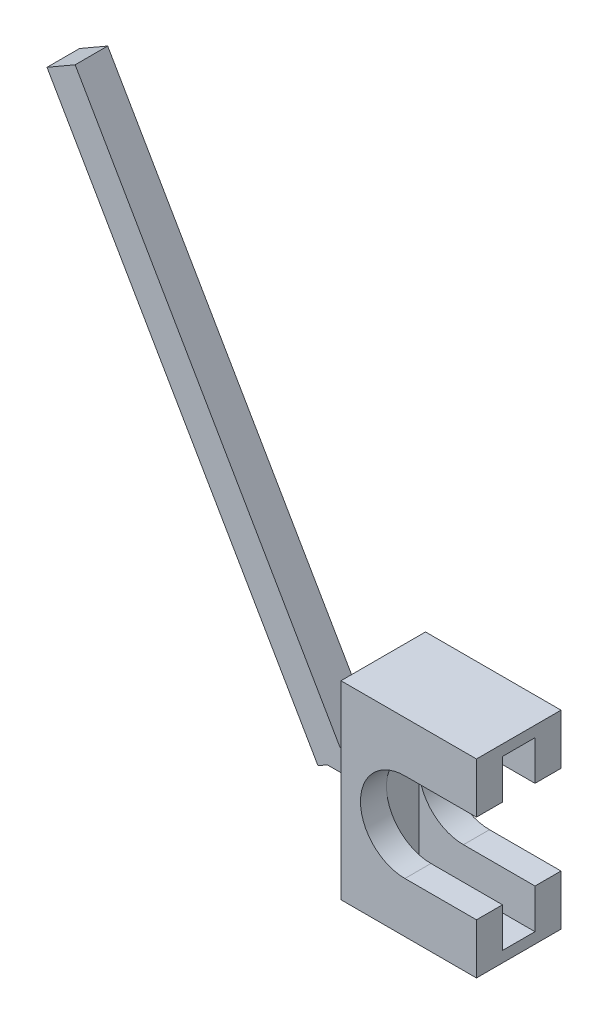
ISO-10303-21;
HEADER;
FILE_DESCRIPTION(('STEP AP214'),'2;1');
FILE_NAME('part.step','',(''),(''),'','','');
FILE_SCHEMA(('AUTOMOTIVE_DESIGN { 1 0 10303 214 1 1 1 1 }'));
ENDSEC;
DATA;
#1=APPLICATION_CONTEXT('core data for automotive mechanical design processes');
#2=APPLICATION_PROTOCOL_DEFINITION('international standard','automotive_design',2000,#1);
#3=PRODUCT_CONTEXT('',#1,'mechanical');
#4=PRODUCT('Part','Part','',(#3));
#5=PRODUCT_RELATED_PRODUCT_CATEGORY('part','',(#4));
#6=PRODUCT_DEFINITION_FORMATION('','',#4);
#7=PRODUCT_DEFINITION_CONTEXT('part definition',#1,'design');
#8=PRODUCT_DEFINITION('design','',#6,#7);
#9=PRODUCT_DEFINITION_SHAPE('','',#8);
#10=(LENGTH_UNIT() NAMED_UNIT(*) SI_UNIT(.MILLI.,.METRE.));
#11=(NAMED_UNIT(*) PLANE_ANGLE_UNIT() SI_UNIT($,.RADIAN.));
#12=(NAMED_UNIT(*) SI_UNIT($,.STERADIAN.) SOLID_ANGLE_UNIT());
#13=UNCERTAINTY_MEASURE_WITH_UNIT(LENGTH_MEASURE(1.E-05),#10,'distance_accuracy_value','');
#14=(GEOMETRIC_REPRESENTATION_CONTEXT(3) GLOBAL_UNCERTAINTY_ASSIGNED_CONTEXT((#13)) GLOBAL_UNIT_ASSIGNED_CONTEXT((#10,
#11,#12)) REPRESENTATION_CONTEXT('',''));
#15=CARTESIAN_POINT('',(0.,0.,0.));
#16=DIRECTION('',(0.,0.,1.));
#17=DIRECTION('',(1.,0.,0.));
#18=AXIS2_PLACEMENT_3D('',#15,#16,#17);
#19=CARTESIAN_POINT('',(-43.2326438930958,18.415,13.716));
#20=DIRECTION('',(0.866025403784438,0.5,0.));
#21=DIRECTION('',(-0.5,0.866025403784438,0.));
#22=AXIS2_PLACEMENT_3D('',#19,#20,#21);
#23=PLANE('',#22);
#24=DIRECTION('',(0.5,-0.866025403784438,0.));
#25=VECTOR('',#24,1.);
#26=CARTESIAN_POINT('',(-43.2326438930958,18.415,6.096));
#27=LINE('',#26,#25);
#28=CARTESIAN_POINT('',(-106.732643893096,128.400226280624,6.096));
#29=VERTEX_POINT('',#28);
#30=CARTESIAN_POINT('',(-43.2326438930958,18.415,6.096));
#31=VERTEX_POINT('',#30);
#32=EDGE_CURVE('P0_E107',#29,#31,#27,.T.);
#33=ORIENTED_EDGE('',*,*,#32,.T.);
#34=DIRECTION('',(0.,0.,-1.));
#35=VECTOR('',#34,1.);
#36=CARTESIAN_POINT('',(-43.2326438930958,18.415,13.716));
#37=LINE('',#36,#35);
#38=CARTESIAN_POINT('',(-43.2326438930958,18.415,13.716));
#39=VERTEX_POINT('',#38);
#40=EDGE_CURVE('P0_E10',#39,#31,#37,.T.);
#41=ORIENTED_EDGE('',*,*,#40,.F.);
#42=DIRECTION('',(0.5,-0.866025403784438,0.));
#43=VECTOR('',#42,1.);
#44=CARTESIAN_POINT('',(-43.2326438930958,18.415,13.716));
#45=LINE('',#44,#43);
#46=CARTESIAN_POINT('',(-106.732643893096,128.400226280624,13.716));
#47=VERTEX_POINT('',#46);
#48=EDGE_CURVE('P0_E110',#47,#39,#45,.T.);
#49=ORIENTED_EDGE('',*,*,#48,.F.);
#50=DIRECTION('',(0.,0.,-1.));
#51=VECTOR('',#50,1.);
#52=CARTESIAN_POINT('',(-106.732643893096,128.400226280624,13.716));
#53=LINE('',#52,#51);
#54=EDGE_CURVE('P0_E119',#47,#29,#53,.T.);
#55=ORIENTED_EDGE('',*,*,#54,.T.);
#56=EDGE_LOOP('',(#33,#41,#49,#55));
#57=FACE_BOUND('',#56,.T.);
#58=ADVANCED_FACE('P0_F16',(#57),#23,.F.);
#59=CARTESIAN_POINT('',(-36.6335303162584,22.225,13.716));
#60=DIRECTION('',(-0.5,0.866025403784438,0.));
#61=DIRECTION('',(-0.866025403784438,-0.5,0.));
#62=AXIS2_PLACEMENT_3D('',#59,#60,#61);
#63=PLANE('',#62);
#64=DIRECTION('',(0.866025403784438,0.5,0.));
#65=VECTOR('',#64,1.);
#66=CARTESIAN_POINT('',(-36.6335303162584,22.225,6.096));
#67=LINE('',#66,#65);
#68=CARTESIAN_POINT('',(-41.0329393674832,19.685,6.096));
#69=VERTEX_POINT('',#68);
#70=EDGE_CURVE('P0_E122',#31,#69,#67,.T.);
#71=ORIENTED_EDGE('',*,*,#70,.T.);
#72=DIRECTION('',(0.,0.,1.));
#73=VECTOR('',#72,1.);
#74=CARTESIAN_POINT('',(-41.0329393674832,19.685,6.096));
#75=LINE('',#74,#73);
#76=CARTESIAN_POINT('',(-41.0329393674832,19.685,13.716));
#77=VERTEX_POINT('',#76);
#78=EDGE_CURVE('P0_E38',#69,#77,#75,.T.);
#79=ORIENTED_EDGE('',*,*,#78,.T.);
#80=DIRECTION('',(0.866025403784438,0.5,0.));
#81=VECTOR('',#80,1.);
#82=CARTESIAN_POINT('',(-36.6335303162584,22.225,13.716));
#83=LINE('',#82,#81);
#84=EDGE_CURVE('P0_E113',#39,#77,#83,.T.);
#85=ORIENTED_EDGE('',*,*,#84,.F.);
#86=ORIENTED_EDGE('',*,*,#40,.T.);
#87=EDGE_LOOP('',(#71,#79,#85,#86));
#88=FACE_BOUND('',#87,.T.);
#89=ADVANCED_FACE('P0_F145',(#88),#63,.F.);
#90=CARTESIAN_POINT('',(-100.133530316258,132.210226280624,13.716));
#91=DIRECTION('',(-0.866025403784438,-0.5,0.));
#92=DIRECTION('',(0.5,-0.866025403784438,0.));
#93=AXIS2_PLACEMENT_3D('',#90,#91,#92);
#94=PLANE('',#93);
#95=DIRECTION('',(-0.5,0.866025403784438,0.));
#96=VECTOR('',#95,1.);
#97=CARTESIAN_POINT('',(-100.133530316258,132.210226280624,13.716));
#98=LINE('',#97,#96);
#99=CARTESIAN_POINT('',(-38.1,24.765,13.716));
#100=VERTEX_POINT('',#99);
#101=CARTESIAN_POINT('',(-100.133530316258,132.210226280624,13.716));
#102=VERTEX_POINT('',#101);
#103=EDGE_CURVE('P0_E30',#100,#102,#98,.T.);
#104=ORIENTED_EDGE('',*,*,#103,.F.);
#105=DIRECTION('',(0.,0.,1.));
#106=VECTOR('',#105,1.);
#107=CARTESIAN_POINT('',(-38.1,24.765,6.096));
#108=LINE('',#107,#106);
#109=CARTESIAN_POINT('',(-38.1,24.765,6.096));
#110=VERTEX_POINT('',#109);
#111=EDGE_CURVE('P0_E105',#110,#100,#108,.T.);
#112=ORIENTED_EDGE('',*,*,#111,.F.);
#113=DIRECTION('',(-0.5,0.866025403784438,0.));
#114=VECTOR('',#113,1.);
#115=CARTESIAN_POINT('',(-100.133530316258,132.210226280624,6.096));
#116=LINE('',#115,#114);
#117=CARTESIAN_POINT('',(-100.133530316258,132.210226280624,6.096));
#118=VERTEX_POINT('',#117);
#119=EDGE_CURVE('P0_E124',#110,#118,#116,.T.);
#120=ORIENTED_EDGE('',*,*,#119,.T.);
#121=DIRECTION('',(0.,0.,-1.));
#122=VECTOR('',#121,1.);
#123=CARTESIAN_POINT('',(-100.133530316258,132.210226280624,13.716));
#124=LINE('',#123,#122);
#125=EDGE_CURVE('P0_E23',#102,#118,#124,.T.);
#126=ORIENTED_EDGE('',*,*,#125,.F.);
#127=EDGE_LOOP('',(#104,#112,#120,#126));
#128=FACE_BOUND('',#127,.T.);
#129=ADVANCED_FACE('P0_F143',(#128),#94,.F.);
#130=CARTESIAN_POINT('',(-106.732643893096,128.400226280624,13.716));
#131=DIRECTION('',(0.5,-0.866025403784438,0.));
#132=DIRECTION('',(0.866025403784438,0.5,0.));
#133=AXIS2_PLACEMENT_3D('',#130,#131,#132);
#134=PLANE('',#133);
#135=DIRECTION('',(-0.866025403784438,-0.5,0.));
#136=VECTOR('',#135,1.);
#137=CARTESIAN_POINT('',(-106.732643893096,128.400226280624,6.096));
#138=LINE('',#137,#136);
#139=EDGE_CURVE('P0_E114',#118,#29,#138,.T.);
#140=ORIENTED_EDGE('',*,*,#139,.T.);
#141=ORIENTED_EDGE('',*,*,#54,.F.);
#142=DIRECTION('',(-0.866025403784438,-0.5,0.));
#143=VECTOR('',#142,1.);
#144=CARTESIAN_POINT('',(-106.732643893096,128.400226280624,13.716));
#145=LINE('',#144,#143);
#146=EDGE_CURVE('P0_E117',#102,#47,#145,.T.);
#147=ORIENTED_EDGE('',*,*,#146,.F.);
#148=ORIENTED_EDGE('',*,*,#125,.T.);
#149=EDGE_LOOP('',(#140,#141,#147,#148));
#150=FACE_BOUND('',#149,.T.);
#151=ADVANCED_FACE('P0_F132',(#150),#134,.F.);
#152=CARTESIAN_POINT('',(-106.732643893096,128.400226280624,13.716));
#153=DIRECTION('',(0.,0.,-1.));
#154=DIRECTION('',(0.866025403784438,0.5,0.));
#155=AXIS2_PLACEMENT_3D('',#152,#153,#154);
#156=PLANE('',#155);
#157=ORIENTED_EDGE('',*,*,#84,.T.);
#158=DIRECTION('',(1.,0.,0.));
#159=VECTOR('',#158,1.);
#160=CARTESIAN_POINT('',(-31.75,19.685,13.716));
#161=LINE('',#160,#159);
#162=CARTESIAN_POINT('',(-31.75,19.685,13.716));
#163=VERTEX_POINT('',#162);
#164=EDGE_CURVE('P0_E102',#77,#163,#161,.T.);
#165=ORIENTED_EDGE('',*,*,#164,.T.);
#166=DIRECTION('',(0.,1.,0.));
#167=VECTOR('',#166,1.);
#168=CARTESIAN_POINT('',(-31.75,24.765,13.716));
#169=LINE('',#168,#167);
#170=CARTESIAN_POINT('',(-31.75,24.765,13.716));
#171=VERTEX_POINT('',#170);
#172=EDGE_CURVE('P0_E80',#163,#171,#169,.T.);
#173=ORIENTED_EDGE('',*,*,#172,.T.);
#174=DIRECTION('',(-1.,0.,0.));
#175=VECTOR('',#174,1.);
#176=CARTESIAN_POINT('',(-31.75,24.765,13.716));
#177=LINE('',#176,#175);
#178=EDGE_CURVE('P0_E96',#171,#100,#177,.T.);
#179=ORIENTED_EDGE('',*,*,#178,.T.);
#180=ORIENTED_EDGE('',*,*,#103,.T.);
#181=ORIENTED_EDGE('',*,*,#146,.T.);
#182=ORIENTED_EDGE('',*,*,#48,.T.);
#183=EDGE_LOOP('',(#157,#165,#173,#179,#180,#181,#182));
#184=FACE_BOUND('',#183,.T.);
#185=ADVANCED_FACE('P0_F139',(#184),#156,.F.);
#186=CARTESIAN_POINT('',(-106.732643893096,128.400226280624,6.096));
#187=DIRECTION('',(0.,0.,-1.));
#188=DIRECTION('',(0.866025403784438,0.5,0.));
#189=AXIS2_PLACEMENT_3D('',#186,#187,#188);
#190=PLANE('',#189);
#191=DIRECTION('',(1.,0.,0.));
#192=VECTOR('',#191,1.);
#193=CARTESIAN_POINT('',(-31.75,19.685,6.096));
#194=LINE('',#193,#192);
#195=CARTESIAN_POINT('',(-31.75,19.685,6.096));
#196=VERTEX_POINT('',#195);
#197=EDGE_CURVE('P0_E91',#69,#196,#194,.T.);
#198=ORIENTED_EDGE('',*,*,#197,.F.);
#199=ORIENTED_EDGE('',*,*,#70,.F.);
#200=ORIENTED_EDGE('',*,*,#32,.F.);
#201=ORIENTED_EDGE('',*,*,#139,.F.);
#202=ORIENTED_EDGE('',*,*,#119,.F.);
#203=DIRECTION('',(-1.,0.,0.));
#204=VECTOR('',#203,1.);
#205=CARTESIAN_POINT('',(-31.75,24.765,6.096));
#206=LINE('',#205,#204);
#207=CARTESIAN_POINT('',(-31.75,24.765,6.096));
#208=VERTEX_POINT('',#207);
#209=EDGE_CURVE('P0_E93',#208,#110,#206,.T.);
#210=ORIENTED_EDGE('',*,*,#209,.F.);
#211=DIRECTION('',(0.,1.,0.));
#212=VECTOR('',#211,1.);
#213=CARTESIAN_POINT('',(-31.75,24.765,6.096));
#214=LINE('',#213,#212);
#215=EDGE_CURVE('P0_E78',#196,#208,#214,.T.);
#216=ORIENTED_EDGE('',*,*,#215,.F.);
#217=EDGE_LOOP('',(#198,#199,#200,#201,#202,#210,#216));
#218=FACE_BOUND('',#217,.T.);
#219=ADVANCED_FACE('P0_F90',(#218),#190,.T.);
#220=CARTESIAN_POINT('',(-31.75,24.765,6.096));
#221=DIRECTION('',(0.,1.,0.));
#222=DIRECTION('',(-1.,0.,0.));
#223=AXIS2_PLACEMENT_3D('',#220,#221,#222);
#224=PLANE('',#223);
#225=ORIENTED_EDGE('',*,*,#178,.F.);
#226=DIRECTION('',(0.,0.,1.));
#227=VECTOR('',#226,1.);
#228=CARTESIAN_POINT('',(-31.75,24.765,6.096));
#229=LINE('',#228,#227);
#230=EDGE_CURVE('P0_E85',#208,#171,#229,.T.);
#231=ORIENTED_EDGE('',*,*,#230,.F.);
#232=ORIENTED_EDGE('',*,*,#209,.T.);
#233=ORIENTED_EDGE('',*,*,#111,.T.);
#234=EDGE_LOOP('',(#225,#231,#232,#233));
#235=FACE_BOUND('',#234,.T.);
#236=ADVANCED_FACE('P0_F142',(#235),#224,.T.);
#237=CARTESIAN_POINT('',(-31.75,24.765,6.096));
#238=DIRECTION('',(1.,0.,0.));
#239=DIRECTION('',(0.,1.,0.));
#240=AXIS2_PLACEMENT_3D('',#237,#238,#239);
#241=PLANE('',#240);
#242=ORIENTED_EDGE('',*,*,#172,.F.);
#243=DIRECTION('',(0.,0.,1.));
#244=VECTOR('',#243,1.);
#245=CARTESIAN_POINT('',(-31.75,19.685,6.096));
#246=LINE('',#245,#244);
#247=EDGE_CURVE('P0_E75',#196,#163,#246,.T.);
#248=ORIENTED_EDGE('',*,*,#247,.F.);
#249=ORIENTED_EDGE('',*,*,#215,.T.);
#250=ORIENTED_EDGE('',*,*,#230,.T.);
#251=EDGE_LOOP('',(#242,#248,#249,#250));
#252=FACE_BOUND('',#251,.T.);
#253=ADVANCED_FACE('P0_F77',(#252),#241,.T.);
#254=CARTESIAN_POINT('',(-31.75,19.685,6.096));
#255=DIRECTION('',(0.,-1.,0.));
#256=DIRECTION('',(1.,0.,0.));
#257=AXIS2_PLACEMENT_3D('',#254,#255,#256);
#258=PLANE('',#257);
#259=ORIENTED_EDGE('',*,*,#164,.F.);
#260=ORIENTED_EDGE('',*,*,#78,.F.);
#261=ORIENTED_EDGE('',*,*,#197,.T.);
#262=ORIENTED_EDGE('',*,*,#247,.T.);
#263=EDGE_LOOP('',(#259,#260,#261,#262));
#264=FACE_BOUND('',#263,.T.);
#265=ADVANCED_FACE('P0_F95',(#264),#258,.T.);
#266=CLOSED_SHELL('',(#58,#89,#129,#151,#185,#219,#236,#253,#265));
#267=MANIFOLD_SOLID_BREP('P0_B1',#266);
#268=CARTESIAN_POINT('',(0.,0.,19.812));
#269=DIRECTION('',(-1.,0.,0.));
#270=DIRECTION('',(0.,0.,1.));
#271=AXIS2_PLACEMENT_3D('',#268,#269,#270);
#272=PLANE('',#271);
#273=DIRECTION('',(0.,0.,-1.));
#274=VECTOR('',#273,1.);
#275=CARTESIAN_POINT('',(0.,11.811,117.210286360318));
#276=LINE('',#275,#274);
#277=CARTESIAN_POINT('',(0.,11.811,19.812));
#278=VERTEX_POINT('',#277);
#279=CARTESIAN_POINT('',(0.,11.811,13.716));
#280=VERTEX_POINT('',#279);
#281=EDGE_CURVE('P1_E155',#278,#280,#276,.T.);
#282=ORIENTED_EDGE('',*,*,#281,.F.);
#283=DIRECTION('',(0.,1.,0.));
#284=VECTOR('',#283,1.);
#285=CARTESIAN_POINT('',(0.,0.,19.812));
#286=LINE('',#285,#284);
#287=CARTESIAN_POINT('',(0.,0.,19.812));
#288=VERTEX_POINT('',#287);
#289=EDGE_CURVE('P1_E232',#288,#278,#286,.T.);
#290=ORIENTED_EDGE('',*,*,#289,.F.);
#291=DIRECTION('',(0.,0.,-1.));
#292=VECTOR('',#291,1.);
#293=CARTESIAN_POINT('',(0.,0.,19.812));
#294=LINE('',#293,#292);
#295=CARTESIAN_POINT('',(0.,0.,0.));
#296=VERTEX_POINT('',#295);
#297=EDGE_CURVE('P1_E256',#288,#296,#294,.T.);
#298=ORIENTED_EDGE('',*,*,#297,.T.);
#299=DIRECTION('',(0.,1.,0.));
#300=VECTOR('',#299,1.);
#301=CARTESIAN_POINT('',(0.,0.,0.));
#302=LINE('',#301,#300);
#303=CARTESIAN_POINT('',(0.,11.811,0.));
#304=VERTEX_POINT('',#303);
#305=EDGE_CURVE('P1_E242',#296,#304,#302,.T.);
#306=ORIENTED_EDGE('',*,*,#305,.T.);
#307=CARTESIAN_POINT('',(0.,11.811,6.09600000000003));
#308=VERTEX_POINT('',#307);
#309=EDGE_CURVE('P1_E160',#308,#304,#276,.T.);
#310=ORIENTED_EDGE('',*,*,#309,.F.);
#311=DIRECTION('',(0.,1.,0.));
#312=VECTOR('',#311,1.);
#313=CARTESIAN_POINT('',(0.,41.91,6.096));
#314=LINE('',#313,#312);
#315=CARTESIAN_POINT('',(0.,2.54,6.096));
#316=VERTEX_POINT('',#315);
#317=EDGE_CURVE('P1_E212',#316,#308,#314,.T.);
#318=ORIENTED_EDGE('',*,*,#317,.F.);
#319=DIRECTION('',(0.,0.,-1.));
#320=VECTOR('',#319,1.);
#321=CARTESIAN_POINT('',(0.,2.54,13.716));
#322=LINE('',#321,#320);
#323=CARTESIAN_POINT('',(0.,2.54,13.716));
#324=VERTEX_POINT('',#323);
#325=EDGE_CURVE('P1_E208',#324,#316,#322,.T.);
#326=ORIENTED_EDGE('',*,*,#325,.F.);
#327=DIRECTION('',(0.,-1.,0.));
#328=VECTOR('',#327,1.);
#329=CARTESIAN_POINT('',(0.,2.54,13.716));
#330=LINE('',#329,#328);
#331=EDGE_CURVE('P1_E191',#280,#324,#330,.T.);
#332=ORIENTED_EDGE('',*,*,#331,.F.);
#333=EDGE_LOOP('',(#282,#290,#298,#306,#310,#318,#326,#332));
#334=FACE_BOUND('',#333,.T.);
#335=ADVANCED_FACE('P1_F17',(#334),#272,.F.);
#336=CARTESIAN_POINT('',(0.,0.,19.812));
#337=DIRECTION('',(0.,0.,1.));
#338=DIRECTION('',(1.,0.,0.));
#339=AXIS2_PLACEMENT_3D('',#336,#337,#338);
#340=PLANE('',#339);
#341=CARTESIAN_POINT('',(-16.764,22.225,19.812));
#342=DIRECTION('',(0.,0.,1.));
#343=DIRECTION('',(1.,0.,0.));
#344=AXIS2_PLACEMENT_3D('',#341,#342,#343);
#345=CIRCLE('',#344,10.414);
#346=CARTESIAN_POINT('',(-16.764,11.811,19.812));
#347=VERTEX_POINT('',#346);
#348=CARTESIAN_POINT('',(-16.764,32.639,19.812));
#349=VERTEX_POINT('',#348);
#350=EDGE_CURVE('P1_E32',#347,#349,#345,.F.);
#351=ORIENTED_EDGE('',*,*,#350,.T.);
#352=DIRECTION('',(1.,0.,0.));
#353=VECTOR('',#352,1.);
#354=CARTESIAN_POINT('',(0.,32.639,19.812));
#355=LINE('',#354,#353);
#356=CARTESIAN_POINT('',(0.,32.639,19.812));
#357=VERTEX_POINT('',#356);
#358=EDGE_CURVE('P1_E189',#349,#357,#355,.T.);
#359=ORIENTED_EDGE('',*,*,#358,.T.);
#360=CARTESIAN_POINT('',(0.,44.45,19.812));
#361=VERTEX_POINT('',#360);
#362=EDGE_CURVE('P1_E230',#357,#361,#286,.T.);
#363=ORIENTED_EDGE('',*,*,#362,.T.);
#364=DIRECTION('',(-1.,0.,0.));
#365=VECTOR('',#364,1.);
#366=CARTESIAN_POINT('',(0.,44.45,19.812));
#367=LINE('',#366,#365);
#368=CARTESIAN_POINT('',(-31.75,44.45,19.812));
#369=VERTEX_POINT('',#368);
#370=EDGE_CURVE('P1_E234',#361,#369,#367,.T.);
#371=ORIENTED_EDGE('',*,*,#370,.T.);
#372=DIRECTION('',(0.,-1.,0.));
#373=VECTOR('',#372,1.);
#374=CARTESIAN_POINT('',(-31.75,44.45,19.812));
#375=LINE('',#374,#373);
#376=CARTESIAN_POINT('',(-31.75,0.,19.812));
#377=VERTEX_POINT('',#376);
#378=EDGE_CURVE('P1_E236',#369,#377,#375,.T.);
#379=ORIENTED_EDGE('',*,*,#378,.T.);
#380=DIRECTION('',(1.,0.,0.));
#381=VECTOR('',#380,1.);
#382=CARTESIAN_POINT('',(-31.75,0.,19.812));
#383=LINE('',#382,#381);
#384=EDGE_CURVE('P1_E227',#377,#288,#383,.T.);
#385=ORIENTED_EDGE('',*,*,#384,.T.);
#386=ORIENTED_EDGE('',*,*,#289,.T.);
#387=DIRECTION('',(-1.,0.,0.));
#388=VECTOR('',#387,1.);
#389=CARTESIAN_POINT('',(0.,11.811,19.812));
#390=LINE('',#389,#388);
#391=EDGE_CURVE('P1_E37',#278,#347,#390,.T.);
#392=ORIENTED_EDGE('',*,*,#391,.T.);
#393=EDGE_LOOP('',(#351,#359,#363,#371,#379,#385,#386,#392));
#394=FACE_BOUND('',#393,.T.);
#395=ADVANCED_FACE('P1_F299',(#394),#340,.T.);
#396=CARTESIAN_POINT('',(0.,0.,0.));
#397=DIRECTION('',(0.,0.,1.));
#398=DIRECTION('',(1.,0.,0.));
#399=AXIS2_PLACEMENT_3D('',#396,#397,#398);
#400=PLANE('',#399);
#401=DIRECTION('',(1.,0.,0.));
#402=VECTOR('',#401,1.);
#403=CARTESIAN_POINT('',(0.,32.639,0.));
#404=LINE('',#403,#402);
#405=CARTESIAN_POINT('',(-16.764,32.639,0.));
#406=VERTEX_POINT('',#405);
#407=CARTESIAN_POINT('',(0.,32.639,0.));
#408=VERTEX_POINT('',#407);
#409=EDGE_CURVE('P1_E186',#406,#408,#404,.T.);
#410=ORIENTED_EDGE('',*,*,#409,.F.);
#411=CARTESIAN_POINT('',(-16.764,22.225,0.));
#412=DIRECTION('',(0.,0.,1.));
#413=DIRECTION('',(1.,0.,0.));
#414=AXIS2_PLACEMENT_3D('',#411,#412,#413);
#415=CIRCLE('',#414,10.414);
#416=CARTESIAN_POINT('',(-16.764,11.811,0.));
#417=VERTEX_POINT('',#416);
#418=EDGE_CURVE('P1_E146',#417,#406,#415,.F.);
#419=ORIENTED_EDGE('',*,*,#418,.F.);
#420=DIRECTION('',(-1.,0.,0.));
#421=VECTOR('',#420,1.);
#422=CARTESIAN_POINT('',(0.,11.811,0.));
#423=LINE('',#422,#421);
#424=EDGE_CURVE('P1_E156',#304,#417,#423,.T.);
#425=ORIENTED_EDGE('',*,*,#424,.F.);
#426=ORIENTED_EDGE('',*,*,#305,.F.);
#427=DIRECTION('',(1.,0.,0.));
#428=VECTOR('',#427,1.);
#429=CARTESIAN_POINT('',(-31.75,0.,0.));
#430=LINE('',#429,#428);
#431=CARTESIAN_POINT('',(-31.75,0.,0.));
#432=VERTEX_POINT('',#431);
#433=EDGE_CURVE('P1_E219',#432,#296,#430,.T.);
#434=ORIENTED_EDGE('',*,*,#433,.F.);
#435=DIRECTION('',(0.,-1.,0.));
#436=VECTOR('',#435,1.);
#437=CARTESIAN_POINT('',(-31.75,44.45,0.));
#438=LINE('',#437,#436);
#439=CARTESIAN_POINT('',(-31.75,44.45,0.));
#440=VERTEX_POINT('',#439);
#441=EDGE_CURVE('P1_E231',#440,#432,#438,.T.);
#442=ORIENTED_EDGE('',*,*,#441,.F.);
#443=DIRECTION('',(-1.,0.,0.));
#444=VECTOR('',#443,1.);
#445=CARTESIAN_POINT('',(0.,44.45,0.));
#446=LINE('',#445,#444);
#447=CARTESIAN_POINT('',(0.,44.45,0.));
#448=VERTEX_POINT('',#447);
#449=EDGE_CURVE('P1_E245',#448,#440,#446,.T.);
#450=ORIENTED_EDGE('',*,*,#449,.F.);
#451=EDGE_CURVE('P1_E241',#408,#448,#302,.T.);
#452=ORIENTED_EDGE('',*,*,#451,.F.);
#453=EDGE_LOOP('',(#410,#419,#425,#426,#434,#442,#450,#452));
#454=FACE_BOUND('',#453,.T.);
#455=ADVANCED_FACE('P1_F287',(#454),#400,.F.);
#456=CARTESIAN_POINT('',(-27.178,2.54,13.716));
#457=DIRECTION('',(0.,0.,1.));
#458=DIRECTION('',(1.,0.,0.));
#459=AXIS2_PLACEMENT_3D('',#456,#457,#458);
#460=PLANE('',#459);
#461=DIRECTION('',(1.,0.,0.));
#462=VECTOR('',#461,1.);
#463=CARTESIAN_POINT('',(-27.178,32.639,13.716));
#464=LINE('',#463,#462);
#465=CARTESIAN_POINT('',(-16.764,32.639,13.716));
#466=VERTEX_POINT('',#465);
#467=CARTESIAN_POINT('',(0.,32.639,13.716));
#468=VERTEX_POINT('',#467);
#469=EDGE_CURVE('P1_E183',#466,#468,#464,.T.);
#470=ORIENTED_EDGE('',*,*,#469,.F.);
#471=CARTESIAN_POINT('',(-16.764,22.225,13.716));
#472=DIRECTION('',(0.,0.,1.));
#473=DIRECTION('',(1.,0.,0.));
#474=AXIS2_PLACEMENT_3D('',#471,#472,#473);
#475=CIRCLE('',#474,10.414);
#476=CARTESIAN_POINT('',(-27.178,22.225,13.716));
#477=VERTEX_POINT('',#476);
#478=EDGE_CURVE('P1_E149',#477,#466,#475,.F.);
#479=ORIENTED_EDGE('',*,*,#478,.F.);
#480=DIRECTION('',(0.,-1.,0.));
#481=VECTOR('',#480,1.);
#482=CARTESIAN_POINT('',(-27.178,2.54,13.716));
#483=LINE('',#482,#481);
#484=CARTESIAN_POINT('',(-27.178,41.91,13.716));
#485=VERTEX_POINT('',#484);
#486=EDGE_CURVE('P1_E192',#485,#477,#483,.T.);
#487=ORIENTED_EDGE('',*,*,#486,.F.);
#488=DIRECTION('',(1.,0.,0.));
#489=VECTOR('',#488,1.);
#490=CARTESIAN_POINT('',(-27.178,41.91,13.716));
#491=LINE('',#490,#489);
#492=CARTESIAN_POINT('',(0.,41.91,13.716));
#493=VERTEX_POINT('',#492);
#494=EDGE_CURVE('P1_E217',#485,#493,#491,.T.);
#495=ORIENTED_EDGE('',*,*,#494,.T.);
#496=EDGE_CURVE('P1_E205',#493,#468,#330,.T.);
#497=ORIENTED_EDGE('',*,*,#496,.T.);
#498=EDGE_LOOP('',(#470,#479,#487,#495,#497));
#499=FACE_BOUND('',#498,.T.);
#500=ADVANCED_FACE('P1_F307',(#499),#460,.F.);
#501=CARTESIAN_POINT('',(-16.764,11.811,13.716));
#502=VERTEX_POINT('',#501);
#503=EDGE_CURVE('P1_E135',#502,#477,#475,.F.);
#504=ORIENTED_EDGE('',*,*,#503,.F.);
#505=DIRECTION('',(-1.,0.,0.));
#506=VECTOR('',#505,1.);
#507=CARTESIAN_POINT('',(-27.178,11.811,13.716));
#508=LINE('',#507,#506);
#509=EDGE_CURVE('P1_E138',#280,#502,#508,.T.);
#510=ORIENTED_EDGE('',*,*,#509,.F.);
#511=ORIENTED_EDGE('',*,*,#331,.T.);
#512=DIRECTION('',(1.,0.,0.));
#513=VECTOR('',#512,1.);
#514=CARTESIAN_POINT('',(-27.178,2.54,13.716));
#515=LINE('',#514,#513);
#516=CARTESIAN_POINT('',(-27.178,2.54,13.716));
#517=VERTEX_POINT('',#516);
#518=EDGE_CURVE('P1_E204',#517,#324,#515,.T.);
#519=ORIENTED_EDGE('',*,*,#518,.F.);
#520=EDGE_CURVE('P1_E141',#477,#517,#483,.T.);
#521=ORIENTED_EDGE('',*,*,#520,.F.);
#522=EDGE_LOOP('',(#504,#510,#511,#519,#521));
#523=FACE_BOUND('',#522,.T.);
#524=ADVANCED_FACE('P1_F137',(#523),#460,.F.);
#525=CARTESIAN_POINT('',(-27.178,41.91,6.096));
#526=DIRECTION('',(0.,0.,-1.));
#527=DIRECTION('',(-1.,0.,0.));
#528=AXIS2_PLACEMENT_3D('',#525,#526,#527);
#529=PLANE('',#528);
#530=DIRECTION('',(-1.,0.,0.));
#531=VECTOR('',#530,1.);
#532=CARTESIAN_POINT('',(-27.178,32.639,6.096));
#533=LINE('',#532,#531);
#534=CARTESIAN_POINT('',(0.,32.639,6.096));
#535=VERTEX_POINT('',#534);
#536=CARTESIAN_POINT('',(-16.764,32.639,6.096));
#537=VERTEX_POINT('',#536);
#538=EDGE_CURVE('P1_E11',#535,#537,#533,.T.);
#539=ORIENTED_EDGE('',*,*,#538,.F.);
#540=CARTESIAN_POINT('',(0.,41.91,6.096));
#541=VERTEX_POINT('',#540);
#542=EDGE_CURVE('P1_E211',#535,#541,#314,.T.);
#543=ORIENTED_EDGE('',*,*,#542,.T.);
#544=DIRECTION('',(1.,0.,0.));
#545=VECTOR('',#544,1.);
#546=CARTESIAN_POINT('',(-27.178,41.91,6.096));
#547=LINE('',#546,#545);
#548=CARTESIAN_POINT('',(-27.178,41.91,6.096));
#549=VERTEX_POINT('',#548);
#550=EDGE_CURVE('P1_E220',#549,#541,#547,.T.);
#551=ORIENTED_EDGE('',*,*,#550,.F.);
#552=DIRECTION('',(0.,1.,0.));
#553=VECTOR('',#552,1.);
#554=CARTESIAN_POINT('',(-27.178,41.91,6.096));
#555=LINE('',#554,#553);
#556=CARTESIAN_POINT('',(-27.178,22.225,6.096));
#557=VERTEX_POINT('',#556);
#558=EDGE_CURVE('P1_E197',#557,#549,#555,.T.);
#559=ORIENTED_EDGE('',*,*,#558,.F.);
#560=CARTESIAN_POINT('',(-16.764,22.225,6.096));
#561=DIRECTION('',(0.,0.,-1.));
#562=DIRECTION('',(-1.,0.,0.));
#563=AXIS2_PLACEMENT_3D('',#560,#561,#562);
#564=CIRCLE('',#563,10.414);
#565=EDGE_CURVE('P1_E147',#537,#557,#564,.F.);
#566=ORIENTED_EDGE('',*,*,#565,.F.);
#567=EDGE_LOOP('',(#539,#543,#551,#559,#566));
#568=FACE_BOUND('',#567,.T.);
#569=ADVANCED_FACE('P1_F273',(#568),#529,.F.);
#570=CARTESIAN_POINT('',(-16.764,11.811,6.096));
#571=VERTEX_POINT('',#570);
#572=EDGE_CURVE('P1_E174',#557,#571,#564,.F.);
#573=ORIENTED_EDGE('',*,*,#572,.F.);
#574=CARTESIAN_POINT('',(-27.178,2.54,6.096));
#575=VERTEX_POINT('',#574);
#576=EDGE_CURVE('P1_E198',#575,#557,#555,.T.);
#577=ORIENTED_EDGE('',*,*,#576,.F.);
#578=DIRECTION('',(1.,0.,0.));
#579=VECTOR('',#578,1.);
#580=CARTESIAN_POINT('',(-27.178,2.54,6.096));
#581=LINE('',#580,#579);
#582=EDGE_CURVE('P1_E223',#575,#316,#581,.T.);
#583=ORIENTED_EDGE('',*,*,#582,.T.);
#584=ORIENTED_EDGE('',*,*,#317,.T.);
#585=DIRECTION('',(1.,0.,0.));
#586=VECTOR('',#585,1.);
#587=CARTESIAN_POINT('',(-27.178,11.811,6.096));
#588=LINE('',#587,#586);
#589=EDGE_CURVE('P1_E25',#571,#308,#588,.T.);
#590=ORIENTED_EDGE('',*,*,#589,.F.);
#591=EDGE_LOOP('',(#573,#577,#583,#584,#590));
#592=FACE_BOUND('',#591,.T.);
#593=ADVANCED_FACE('P1_F264',(#592),#529,.F.);
#594=CARTESIAN_POINT('',(-31.75,0.,19.812));
#595=DIRECTION('',(0.,1.,0.));
#596=DIRECTION('',(-1.,0.,0.));
#597=AXIS2_PLACEMENT_3D('',#594,#595,#596);
#598=PLANE('',#597);
#599=ORIENTED_EDGE('',*,*,#433,.T.);
#600=ORIENTED_EDGE('',*,*,#297,.F.);
#601=ORIENTED_EDGE('',*,*,#384,.F.);
#602=DIRECTION('',(0.,0.,-1.));
#603=VECTOR('',#602,1.);
#604=CARTESIAN_POINT('',(-31.75,0.,19.812));
#605=LINE('',#604,#603);
#606=EDGE_CURVE('P1_E238',#377,#432,#605,.T.);
#607=ORIENTED_EDGE('',*,*,#606,.T.);
#608=EDGE_LOOP('',(#599,#600,#601,#607));
#609=FACE_BOUND('',#608,.T.);
#610=ADVANCED_FACE('P1_F19',(#609),#598,.F.);
#611=ORIENTED_EDGE('',*,*,#362,.F.);
#612=DIRECTION('',(0.,0.,-1.));
#613=VECTOR('',#612,1.);
#614=CARTESIAN_POINT('',(0.,32.639,117.210286360318));
#615=LINE('',#614,#613);
#616=EDGE_CURVE('P1_E169',#357,#468,#615,.T.);
#617=ORIENTED_EDGE('',*,*,#616,.T.);
#618=ORIENTED_EDGE('',*,*,#496,.F.);
#619=DIRECTION('',(0.,0.,1.));
#620=VECTOR('',#619,1.);
#621=CARTESIAN_POINT('',(0.,41.91,13.716));
#622=LINE('',#621,#620);
#623=EDGE_CURVE('P1_E214',#541,#493,#622,.T.);
#624=ORIENTED_EDGE('',*,*,#623,.F.);
#625=ORIENTED_EDGE('',*,*,#542,.F.);
#626=EDGE_CURVE('P1_E167',#535,#408,#615,.T.);
#627=ORIENTED_EDGE('',*,*,#626,.T.);
#628=ORIENTED_EDGE('',*,*,#451,.T.);
#629=DIRECTION('',(0.,0.,-1.));
#630=VECTOR('',#629,1.);
#631=CARTESIAN_POINT('',(0.,44.45,19.812));
#632=LINE('',#631,#630);
#633=EDGE_CURVE('P1_E253',#361,#448,#632,.T.);
#634=ORIENTED_EDGE('',*,*,#633,.F.);
#635=EDGE_LOOP('',(#611,#617,#618,#624,#625,#627,#628,#634));
#636=FACE_BOUND('',#635,.T.);
#637=ADVANCED_FACE('P1_F282',(#636),#272,.F.);
#638=CARTESIAN_POINT('',(0.,44.45,19.812));
#639=DIRECTION('',(0.,-1.,0.));
#640=DIRECTION('',(0.,0.,-1.));
#641=AXIS2_PLACEMENT_3D('',#638,#639,#640);
#642=PLANE('',#641);
#643=ORIENTED_EDGE('',*,*,#449,.T.);
#644=DIRECTION('',(0.,0.,-1.));
#645=VECTOR('',#644,1.);
#646=CARTESIAN_POINT('',(-31.75,44.45,19.812));
#647=LINE('',#646,#645);
#648=EDGE_CURVE('P1_E250',#369,#440,#647,.T.);
#649=ORIENTED_EDGE('',*,*,#648,.F.);
#650=ORIENTED_EDGE('',*,*,#370,.F.);
#651=ORIENTED_EDGE('',*,*,#633,.T.);
#652=EDGE_LOOP('',(#643,#649,#650,#651));
#653=FACE_BOUND('',#652,.T.);
#654=ADVANCED_FACE('P1_F292',(#653),#642,.F.);
#655=CARTESIAN_POINT('',(-31.75,44.45,19.812));
#656=DIRECTION('',(1.,0.,0.));
#657=DIRECTION('',(0.,1.,0.));
#658=AXIS2_PLACEMENT_3D('',#655,#656,#657);
#659=PLANE('',#658);
#660=ORIENTED_EDGE('',*,*,#441,.T.);
#661=ORIENTED_EDGE('',*,*,#606,.F.);
#662=ORIENTED_EDGE('',*,*,#378,.F.);
#663=ORIENTED_EDGE('',*,*,#648,.T.);
#664=EDGE_LOOP('',(#660,#661,#662,#663));
#665=FACE_BOUND('',#664,.T.);
#666=ADVANCED_FACE('P1_F296',(#665),#659,.F.);
#667=CARTESIAN_POINT('',(-27.178,41.91,13.716));
#668=DIRECTION('',(0.,1.,0.));
#669=DIRECTION('',(0.,0.,1.));
#670=AXIS2_PLACEMENT_3D('',#667,#668,#669);
#671=PLANE('',#670);
#672=ORIENTED_EDGE('',*,*,#623,.T.);
#673=ORIENTED_EDGE('',*,*,#494,.F.);
#674=DIRECTION('',(0.,0.,1.));
#675=VECTOR('',#674,1.);
#676=CARTESIAN_POINT('',(-27.178,41.91,13.716));
#677=LINE('',#676,#675);
#678=EDGE_CURVE('P1_E201',#549,#485,#677,.T.);
#679=ORIENTED_EDGE('',*,*,#678,.F.);
#680=ORIENTED_EDGE('',*,*,#550,.T.);
#681=EDGE_LOOP('',(#672,#673,#679,#680));
#682=FACE_BOUND('',#681,.T.);
#683=ADVANCED_FACE('P1_F310',(#682),#671,.F.);
#684=CARTESIAN_POINT('',(-27.178,2.54,13.716));
#685=DIRECTION('',(0.,-1.,0.));
#686=DIRECTION('',(0.,0.,-1.));
#687=AXIS2_PLACEMENT_3D('',#684,#685,#686);
#688=PLANE('',#687);
#689=ORIENTED_EDGE('',*,*,#325,.T.);
#690=ORIENTED_EDGE('',*,*,#582,.F.);
#691=DIRECTION('',(0.,0.,-1.));
#692=VECTOR('',#691,1.);
#693=CARTESIAN_POINT('',(-27.178,2.54,13.716));
#694=LINE('',#693,#692);
#695=EDGE_CURVE('P1_E194',#517,#575,#694,.T.);
#696=ORIENTED_EDGE('',*,*,#695,.F.);
#697=ORIENTED_EDGE('',*,*,#518,.T.);
#698=EDGE_LOOP('',(#689,#690,#696,#697));
#699=FACE_BOUND('',#698,.T.);
#700=ADVANCED_FACE('P1_F317',(#699),#688,.F.);
#701=CARTESIAN_POINT('',(-27.178,0.,0.));
#702=DIRECTION('',(-1.,0.,0.));
#703=DIRECTION('',(0.,0.,1.));
#704=AXIS2_PLACEMENT_3D('',#701,#702,#703);
#705=PLANE('',#704);
#706=ORIENTED_EDGE('',*,*,#576,.T.);
#707=ORIENTED_EDGE('',*,*,#558,.T.);
#708=ORIENTED_EDGE('',*,*,#678,.T.);
#709=ORIENTED_EDGE('',*,*,#486,.T.);
#710=ORIENTED_EDGE('',*,*,#520,.T.);
#711=ORIENTED_EDGE('',*,*,#695,.T.);
#712=EDGE_LOOP('',(#706,#707,#708,#709,#710,#711));
#713=FACE_BOUND('',#712,.T.);
#714=ADVANCED_FACE('P1_F313',(#713),#705,.F.);
#715=CARTESIAN_POINT('',(-16.764,11.811,117.210286360318));
#716=DIRECTION('',(0.,1.,0.));
#717=DIRECTION('',(0.,0.,1.));
#718=AXIS2_PLACEMENT_3D('',#715,#716,#717);
#719=PLANE('',#718);
#720=ORIENTED_EDGE('',*,*,#309,.T.);
#721=ORIENTED_EDGE('',*,*,#424,.T.);
#722=DIRECTION('',(0.,0.,-1.));
#723=VECTOR('',#722,1.);
#724=CARTESIAN_POINT('',(-16.764,11.811,117.210286360318));
#725=LINE('',#724,#723);
#726=EDGE_CURVE('P1_E161',#571,#417,#725,.T.);
#727=ORIENTED_EDGE('',*,*,#726,.F.);
#728=ORIENTED_EDGE('',*,*,#589,.T.);
#729=EDGE_LOOP('',(#720,#721,#727,#728));
#730=FACE_BOUND('',#729,.T.);
#731=ADVANCED_FACE('P1_F261',(#730),#719,.T.);
#732=CARTESIAN_POINT('',(-16.764,22.225,117.210286360318));
#733=DIRECTION('',(0.,0.,-1.));
#734=DIRECTION('',(-1.,0.,0.));
#735=AXIS2_PLACEMENT_3D('',#732,#733,#734);
#736=CYLINDRICAL_SURFACE('',#735,10.414);
#737=ORIENTED_EDGE('',*,*,#726,.T.);
#738=ORIENTED_EDGE('',*,*,#418,.T.);
#739=DIRECTION('',(0.,0.,-1.));
#740=VECTOR('',#739,1.);
#741=CARTESIAN_POINT('',(-16.764,32.639,117.210286360318));
#742=LINE('',#741,#740);
#743=EDGE_CURVE('P1_E171',#537,#406,#742,.T.);
#744=ORIENTED_EDGE('',*,*,#743,.F.);
#745=ORIENTED_EDGE('',*,*,#565,.T.);
#746=ORIENTED_EDGE('',*,*,#572,.T.);
#747=EDGE_LOOP('',(#737,#738,#744,#745,#746));
#748=FACE_BOUND('',#747,.T.);
#749=ADVANCED_FACE('P1_F270',(#748),#736,.F.);
#750=CARTESIAN_POINT('',(-16.764,32.639,117.210286360318));
#751=DIRECTION('',(0.,-1.,0.));
#752=DIRECTION('',(0.,0.,-1.));
#753=AXIS2_PLACEMENT_3D('',#750,#751,#752);
#754=PLANE('',#753);
#755=ORIENTED_EDGE('',*,*,#743,.T.);
#756=ORIENTED_EDGE('',*,*,#409,.T.);
#757=ORIENTED_EDGE('',*,*,#626,.F.);
#758=ORIENTED_EDGE('',*,*,#538,.T.);
#759=EDGE_LOOP('',(#755,#756,#757,#758));
#760=FACE_BOUND('',#759,.T.);
#761=ADVANCED_FACE('P1_F278',(#760),#754,.T.);
#762=ORIENTED_EDGE('',*,*,#358,.F.);
#763=EDGE_CURVE('P1_E170',#349,#466,#742,.T.);
#764=ORIENTED_EDGE('',*,*,#763,.T.);
#765=ORIENTED_EDGE('',*,*,#469,.T.);
#766=ORIENTED_EDGE('',*,*,#616,.F.);
#767=EDGE_LOOP('',(#762,#764,#765,#766));
#768=FACE_BOUND('',#767,.T.);
#769=ADVANCED_FACE('P1_F304',(#768),#754,.T.);
#770=ORIENTED_EDGE('',*,*,#391,.F.);
#771=ORIENTED_EDGE('',*,*,#281,.T.);
#772=ORIENTED_EDGE('',*,*,#509,.T.);
#773=EDGE_CURVE('P1_E154',#347,#502,#725,.T.);
#774=ORIENTED_EDGE('',*,*,#773,.F.);
#775=EDGE_LOOP('',(#770,#771,#772,#774));
#776=FACE_BOUND('',#775,.T.);
#777=ADVANCED_FACE('P1_F153',(#776),#719,.T.);
#778=ORIENTED_EDGE('',*,*,#350,.F.);
#779=ORIENTED_EDGE('',*,*,#773,.T.);
#780=ORIENTED_EDGE('',*,*,#503,.T.);
#781=ORIENTED_EDGE('',*,*,#478,.T.);
#782=ORIENTED_EDGE('',*,*,#763,.F.);
#783=EDGE_LOOP('',(#778,#779,#780,#781,#782));
#784=FACE_BOUND('',#783,.T.);
#785=ADVANCED_FACE('P1_F158',(#784),#736,.F.);
#786=CLOSED_SHELL('',(#335,#395,#455,#500,#524,#569,#593,#610,#637,#654,#666,#683,#700,#714,
#731,#749,#761,#769,#777,#785));
#787=MANIFOLD_SOLID_BREP('P1_B1',#786);
#788=ADVANCED_BREP_SHAPE_REPRESENTATION('',(#18,#267,#787),#14);
#789=SHAPE_DEFINITION_REPRESENTATION(#9,#788);
ENDSEC;
END-ISO-10303-21;
